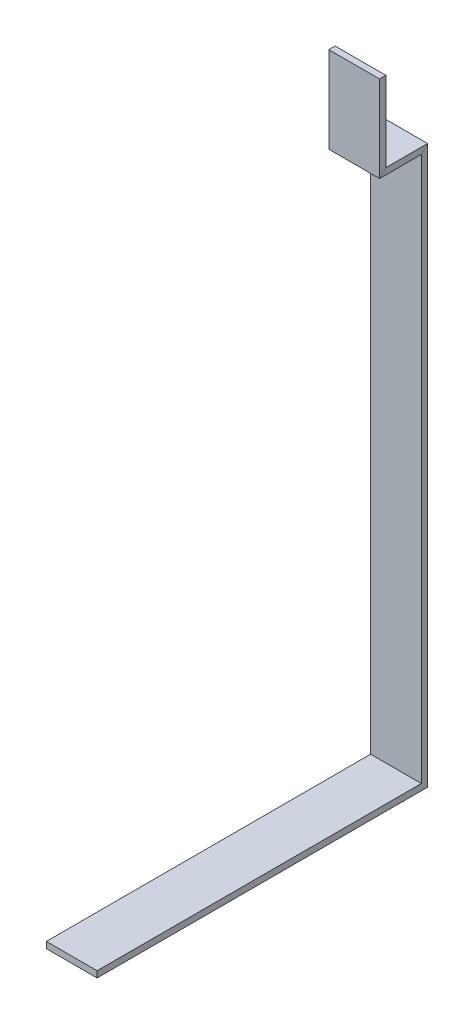
ISO-10303-21;
HEADER;
FILE_DESCRIPTION(('STEP AP214'),'2;1');
FILE_NAME('part.step','',(''),(''),'','','');
FILE_SCHEMA(('AUTOMOTIVE_DESIGN { 1 0 10303 214 1 1 1 1 }'));
ENDSEC;
DATA;
#1=APPLICATION_CONTEXT('core data for automotive mechanical design processes');
#2=APPLICATION_PROTOCOL_DEFINITION('international standard','automotive_design',2000,#1);
#3=PRODUCT_CONTEXT('',#1,'mechanical');
#4=PRODUCT('Part','Part','',(#3));
#5=PRODUCT_RELATED_PRODUCT_CATEGORY('part','',(#4));
#6=PRODUCT_DEFINITION_FORMATION('','',#4);
#7=PRODUCT_DEFINITION_CONTEXT('part definition',#1,'design');
#8=PRODUCT_DEFINITION('design','',#6,#7);
#9=PRODUCT_DEFINITION_SHAPE('','',#8);
#10=(LENGTH_UNIT() NAMED_UNIT(*) SI_UNIT(.MILLI.,.METRE.));
#11=(NAMED_UNIT(*) PLANE_ANGLE_UNIT() SI_UNIT($,.RADIAN.));
#12=(NAMED_UNIT(*) SI_UNIT($,.STERADIAN.) SOLID_ANGLE_UNIT());
#13=UNCERTAINTY_MEASURE_WITH_UNIT(LENGTH_MEASURE(1.E-05),#10,'distance_accuracy_value','');
#14=(GEOMETRIC_REPRESENTATION_CONTEXT(3) GLOBAL_UNCERTAINTY_ASSIGNED_CONTEXT((#13)) GLOBAL_UNIT_ASSIGNED_CONTEXT((#10,
#11,#12)) REPRESENTATION_CONTEXT('',''));
#15=CARTESIAN_POINT('',(0.,0.,0.));
#16=DIRECTION('',(0.,0.,1.));
#17=DIRECTION('',(1.,0.,0.));
#18=AXIS2_PLACEMENT_3D('',#15,#16,#17);
#19=CARTESIAN_POINT('',(25.4,3.155,330.7));
#20=DIRECTION('',(-1.,0.,0.));
#21=DIRECTION('',(0.,0.,1.));
#22=AXIS2_PLACEMENT_3D('',#19,#20,#21);
#23=PLANE('',#22);
#24=DIRECTION('',(0.,0.,-1.));
#25=VECTOR('',#24,1.);
#26=CARTESIAN_POINT('',(25.4,-3.155,330.7));
#27=LINE('',#26,#25);
#28=CARTESIAN_POINT('',(25.4,-3.155,330.7));
#29=VERTEX_POINT('',#28);
#30=CARTESIAN_POINT('',(25.4,-3.155,0.));
#31=VERTEX_POINT('',#30);
#32=EDGE_CURVE('E195',#29,#31,#27,.T.);
#33=ORIENTED_EDGE('',*,*,#32,.T.);
#34=DIRECTION('',(0.,1.,0.));
#35=VECTOR('',#34,1.);
#36=CARTESIAN_POINT('',(25.4,3.155,0.));
#37=LINE('',#36,#35);
#38=CARTESIAN_POINT('',(25.4,554.51,0.));
#39=VERTEX_POINT('',#38);
#40=EDGE_CURVE('E184',#31,#39,#37,.T.);
#41=ORIENTED_EDGE('',*,*,#40,.T.);
#42=DIRECTION('',(0.,-0.707106781186548,0.707106781186548));
#43=VECTOR('',#42,1.);
#44=CARTESIAN_POINT('',(25.4,547.9325,6.5775));
#45=LINE('',#44,#43);
#46=CARTESIAN_POINT('',(25.4,548.2,6.31));
#47=VERTEX_POINT('',#46);
#48=EDGE_CURVE('E141',#39,#47,#45,.T.);
#49=ORIENTED_EDGE('',*,*,#48,.T.);
#50=DIRECTION('',(0.,-1.,0.));
#51=VECTOR('',#50,1.);
#52=CARTESIAN_POINT('',(25.4,541.355,6.31));
#53=LINE('',#52,#51);
#54=CARTESIAN_POINT('',(25.4,3.155,6.31000000000004));
#55=VERTEX_POINT('',#54);
#56=EDGE_CURVE('E116',#47,#55,#53,.T.);
#57=ORIENTED_EDGE('',*,*,#56,.T.);
#58=DIRECTION('',(0.,0.,-1.));
#59=VECTOR('',#58,1.);
#60=CARTESIAN_POINT('',(25.4,3.155,330.7));
#61=LINE('',#60,#59);
#62=CARTESIAN_POINT('',(25.4,3.155,330.7));
#63=VERTEX_POINT('',#62);
#64=EDGE_CURVE('E11',#63,#55,#61,.T.);
#65=ORIENTED_EDGE('',*,*,#64,.F.);
#66=DIRECTION('',(0.,1.,0.));
#67=VECTOR('',#66,1.);
#68=CARTESIAN_POINT('',(25.4,3.155,330.7));
#69=LINE('',#68,#67);
#70=EDGE_CURVE('E185',#29,#63,#69,.T.);
#71=ORIENTED_EDGE('',*,*,#70,.F.);
#72=EDGE_LOOP('',(#33,#41,#49,#57,#65,#71));
#73=FACE_BOUND('',#72,.T.);
#74=ADVANCED_FACE('F35',(#73),#23,.F.);
#75=CARTESIAN_POINT('',(-25.4,3.155,330.7));
#76=DIRECTION('',(0.,-1.,0.));
#77=DIRECTION('',(0.,0.,-1.));
#78=AXIS2_PLACEMENT_3D('',#75,#76,#77);
#79=PLANE('',#78);
#80=ORIENTED_EDGE('',*,*,#64,.T.);
#81=DIRECTION('',(-1.,0.,0.));
#82=VECTOR('',#81,1.);
#83=CARTESIAN_POINT('',(-25.3999999999999,3.155,6.30999999999998));
#84=LINE('',#83,#82);
#85=CARTESIAN_POINT('',(-25.4,3.155,6.30999999999998));
#86=VERTEX_POINT('',#85);
#87=EDGE_CURVE('E51',#55,#86,#84,.T.);
#88=ORIENTED_EDGE('',*,*,#87,.T.);
#89=DIRECTION('',(0.,0.,-1.));
#90=VECTOR('',#89,1.);
#91=CARTESIAN_POINT('',(-25.4,3.155,330.7));
#92=LINE('',#91,#90);
#93=CARTESIAN_POINT('',(-25.4,3.155,330.7));
#94=VERTEX_POINT('',#93);
#95=EDGE_CURVE('E42',#94,#86,#92,.T.);
#96=ORIENTED_EDGE('',*,*,#95,.F.);
#97=DIRECTION('',(-1.,0.,0.));
#98=VECTOR('',#97,1.);
#99=CARTESIAN_POINT('',(-25.4,3.155,330.7));
#100=LINE('',#99,#98);
#101=EDGE_CURVE('E188',#63,#94,#100,.T.);
#102=ORIENTED_EDGE('',*,*,#101,.F.);
#103=EDGE_LOOP('',(#80,#88,#96,#102));
#104=FACE_BOUND('',#103,.T.);
#105=ADVANCED_FACE('F248',(#104),#79,.F.);
#106=CARTESIAN_POINT('',(-25.4,3.155,330.7));
#107=DIRECTION('',(1.,0.,0.));
#108=DIRECTION('',(0.,0.,-1.));
#109=AXIS2_PLACEMENT_3D('',#106,#107,#108);
#110=PLANE('',#109);
#111=ORIENTED_EDGE('',*,*,#95,.T.);
#112=DIRECTION('',(0.,-1.,0.));
#113=VECTOR('',#112,1.);
#114=CARTESIAN_POINT('',(-25.4,541.355,6.30999999999998));
#115=LINE('',#114,#113);
#116=CARTESIAN_POINT('',(-25.4,548.2,6.31));
#117=VERTEX_POINT('',#116);
#118=EDGE_CURVE('E108',#117,#86,#115,.T.);
#119=ORIENTED_EDGE('',*,*,#118,.F.);
#120=DIRECTION('',(0.,0.707106781186548,-0.707106781186548));
#121=VECTOR('',#120,1.);
#122=CARTESIAN_POINT('',(-25.4,544.7775,9.73249999999999));
#123=LINE('',#122,#121);
#124=CARTESIAN_POINT('',(-25.4,554.51,0.));
#125=VERTEX_POINT('',#124);
#126=EDGE_CURVE('E112',#117,#125,#123,.T.);
#127=ORIENTED_EDGE('',*,*,#126,.T.);
#128=DIRECTION('',(0.,-1.,0.));
#129=VECTOR('',#128,1.);
#130=CARTESIAN_POINT('',(-25.4,3.155,0.));
#131=LINE('',#130,#129);
#132=CARTESIAN_POINT('',(-25.4,-3.155,0.));
#133=VERTEX_POINT('',#132);
#134=EDGE_CURVE('E197',#125,#133,#131,.T.);
#135=ORIENTED_EDGE('',*,*,#134,.T.);
#136=DIRECTION('',(0.,0.,-1.));
#137=VECTOR('',#136,1.);
#138=CARTESIAN_POINT('',(-25.4,-3.155,330.7));
#139=LINE('',#138,#137);
#140=CARTESIAN_POINT('',(-25.4,-3.155,330.7));
#141=VERTEX_POINT('',#140);
#142=EDGE_CURVE('E202',#141,#133,#139,.T.);
#143=ORIENTED_EDGE('',*,*,#142,.F.);
#144=DIRECTION('',(0.,-1.,0.));
#145=VECTOR('',#144,1.);
#146=CARTESIAN_POINT('',(-25.4,3.155,330.7));
#147=LINE('',#146,#145);
#148=EDGE_CURVE('E191',#94,#141,#147,.T.);
#149=ORIENTED_EDGE('',*,*,#148,.F.);
#150=EDGE_LOOP('',(#111,#119,#127,#135,#143,#149));
#151=FACE_BOUND('',#150,.T.);
#152=ADVANCED_FACE('F110',(#151),#110,.F.);
#153=CARTESIAN_POINT('',(-25.4,-3.155,330.7));
#154=DIRECTION('',(0.,1.,0.));
#155=DIRECTION('',(0.,0.,1.));
#156=AXIS2_PLACEMENT_3D('',#153,#154,#155);
#157=PLANE('',#156);
#158=ORIENTED_EDGE('',*,*,#142,.T.);
#159=DIRECTION('',(1.,0.,0.));
#160=VECTOR('',#159,1.);
#161=CARTESIAN_POINT('',(-25.4,-3.155,0.));
#162=LINE('',#161,#160);
#163=EDGE_CURVE('E189',#133,#31,#162,.T.);
#164=ORIENTED_EDGE('',*,*,#163,.T.);
#165=ORIENTED_EDGE('',*,*,#32,.F.);
#166=DIRECTION('',(1.,0.,0.));
#167=VECTOR('',#166,1.);
#168=CARTESIAN_POINT('',(-25.4,-3.155,330.7));
#169=LINE('',#168,#167);
#170=EDGE_CURVE('E193',#141,#29,#169,.T.);
#171=ORIENTED_EDGE('',*,*,#170,.F.);
#172=EDGE_LOOP('',(#158,#164,#165,#171));
#173=FACE_BOUND('',#172,.T.);
#174=ADVANCED_FACE('F206',(#173),#157,.F.);
#175=CARTESIAN_POINT('',(0.,0.,330.7));
#176=DIRECTION('',(0.,0.,1.));
#177=DIRECTION('',(1.,0.,0.));
#178=AXIS2_PLACEMENT_3D('',#175,#176,#177);
#179=PLANE('',#178);
#180=ORIENTED_EDGE('',*,*,#70,.T.);
#181=ORIENTED_EDGE('',*,*,#101,.T.);
#182=ORIENTED_EDGE('',*,*,#148,.T.);
#183=ORIENTED_EDGE('',*,*,#170,.T.);
#184=EDGE_LOOP('',(#180,#181,#182,#183));
#185=FACE_BOUND('',#184,.T.);
#186=ADVANCED_FACE('F259',(#185),#179,.T.);
#187=CARTESIAN_POINT('',(0.,0.,0.));
#188=DIRECTION('',(0.,0.,1.));
#189=DIRECTION('',(1.,0.,0.));
#190=AXIS2_PLACEMENT_3D('',#187,#188,#189);
#191=PLANE('',#190);
#192=ORIENTED_EDGE('',*,*,#40,.F.);
#193=ORIENTED_EDGE('',*,*,#163,.F.);
#194=ORIENTED_EDGE('',*,*,#134,.F.);
#195=DIRECTION('',(1.,0.,0.));
#196=VECTOR('',#195,1.);
#197=CARTESIAN_POINT('',(-25.4,554.51,0.));
#198=LINE('',#197,#196);
#199=EDGE_CURVE('E127',#125,#39,#198,.T.);
#200=ORIENTED_EDGE('',*,*,#199,.T.);
#201=EDGE_LOOP('',(#192,#193,#194,#200));
#202=FACE_BOUND('',#201,.T.);
#203=ADVANCED_FACE('F212',(#202),#191,.F.);
#204=CARTESIAN_POINT('',(25.4,541.355,6.31));
#205=DIRECTION('',(0.,0.,1.));
#206=DIRECTION('',(1.,0.,0.));
#207=AXIS2_PLACEMENT_3D('',#204,#205,#206);
#208=PLANE('',#207);
#209=ORIENTED_EDGE('',*,*,#87,.F.);
#210=ORIENTED_EDGE('',*,*,#56,.F.);
#211=DIRECTION('',(-1.,0.,0.));
#212=VECTOR('',#211,1.);
#213=CARTESIAN_POINT('',(25.4,548.2,6.31));
#214=LINE('',#213,#212);
#215=EDGE_CURVE('E135',#47,#117,#214,.T.);
#216=ORIENTED_EDGE('',*,*,#215,.T.);
#217=ORIENTED_EDGE('',*,*,#118,.T.);
#218=EDGE_LOOP('',(#209,#210,#216,#217));
#219=FACE_BOUND('',#218,.T.);
#220=ADVANCED_FACE('F139',(#219),#208,.T.);
#221=CARTESIAN_POINT('',(0.,634.515,41.8100000000001));
#222=DIRECTION('',(0.,-1.,0.));
#223=DIRECTION('',(0.,0.,-1.));
#224=AXIS2_PLACEMENT_3D('',#221,#222,#223);
#225=PLANE('',#224);
#226=DIRECTION('',(0.,0.,-1.));
#227=VECTOR('',#226,1.);
#228=CARTESIAN_POINT('',(25.4,634.515,41.8100000000001));
#229=LINE('',#228,#227);
#230=CARTESIAN_POINT('',(25.4,634.515,48.1200000000001));
#231=VERTEX_POINT('',#230);
#232=CARTESIAN_POINT('',(25.4,634.515,41.8100000000001));
#233=VERTEX_POINT('',#232);
#234=EDGE_CURVE('E166',#231,#233,#229,.T.);
#235=ORIENTED_EDGE('',*,*,#234,.T.);
#236=DIRECTION('',(-1.,0.,0.));
#237=VECTOR('',#236,1.);
#238=CARTESIAN_POINT('',(-25.4,634.515,41.8100000000001));
#239=LINE('',#238,#237);
#240=CARTESIAN_POINT('',(-25.4,634.515,41.8100000000001));
#241=VERTEX_POINT('',#240);
#242=EDGE_CURVE('E164',#233,#241,#239,.T.);
#243=ORIENTED_EDGE('',*,*,#242,.T.);
#244=DIRECTION('',(0.,0.,1.));
#245=VECTOR('',#244,1.);
#246=CARTESIAN_POINT('',(-25.4,634.515,48.1200000000001));
#247=LINE('',#246,#245);
#248=CARTESIAN_POINT('',(-25.4,634.515,48.1200000000001));
#249=VERTEX_POINT('',#248);
#250=EDGE_CURVE('E170',#241,#249,#247,.T.);
#251=ORIENTED_EDGE('',*,*,#250,.T.);
#252=DIRECTION('',(1.,0.,0.));
#253=VECTOR('',#252,1.);
#254=CARTESIAN_POINT('',(25.4,634.515,48.1200000000001));
#255=LINE('',#254,#253);
#256=EDGE_CURVE('E168',#249,#231,#255,.T.);
#257=ORIENTED_EDGE('',*,*,#256,.T.);
#258=EDGE_LOOP('',(#235,#243,#251,#257));
#259=FACE_BOUND('',#258,.T.);
#260=ADVANCED_FACE('F232',(#259),#225,.F.);
#261=CARTESIAN_POINT('',(-25.4,547.7845,48.1200000000001));
#262=DIRECTION('',(-1.,0.,0.));
#263=DIRECTION('',(0.,0.,1.));
#264=AXIS2_PLACEMENT_3D('',#261,#262,#263);
#265=PLANE('',#264);
#266=DIRECTION('',(0.,0.707106781186548,-0.707106781186548));
#267=VECTOR('',#266,1.);
#268=CARTESIAN_POINT('',(-25.4,572.46775,23.8522500000001));
#269=LINE('',#268,#267);
#270=CARTESIAN_POINT('',(-25.4,548.2,48.12));
#271=VERTEX_POINT('',#270);
#272=CARTESIAN_POINT('',(-25.4,554.51,41.8100000000001));
#273=VERTEX_POINT('',#272);
#274=EDGE_CURVE('E156',#271,#273,#269,.T.);
#275=ORIENTED_EDGE('',*,*,#274,.F.);
#276=DIRECTION('',(0.,1.,0.));
#277=VECTOR('',#276,1.);
#278=CARTESIAN_POINT('',(-25.4,547.7845,48.1200000000001));
#279=LINE('',#278,#277);
#280=EDGE_CURVE('E178',#271,#249,#279,.T.);
#281=ORIENTED_EDGE('',*,*,#280,.T.);
#282=ORIENTED_EDGE('',*,*,#250,.F.);
#283=DIRECTION('',(0.,1.,0.));
#284=VECTOR('',#283,1.);
#285=CARTESIAN_POINT('',(-25.4,547.7845,41.8100000000001));
#286=LINE('',#285,#284);
#287=EDGE_CURVE('E160',#273,#241,#286,.T.);
#288=ORIENTED_EDGE('',*,*,#287,.F.);
#289=EDGE_LOOP('',(#275,#281,#282,#288));
#290=FACE_BOUND('',#289,.T.);
#291=ADVANCED_FACE('F228',(#290),#265,.T.);
#292=CARTESIAN_POINT('',(25.4,547.7845,48.1200000000001));
#293=DIRECTION('',(0.,0.,1.));
#294=DIRECTION('',(1.,0.,0.));
#295=AXIS2_PLACEMENT_3D('',#292,#293,#294);
#296=PLANE('',#295);
#297=DIRECTION('',(-1.,0.,0.));
#298=VECTOR('',#297,1.);
#299=CARTESIAN_POINT('',(25.4,548.2,48.12));
#300=LINE('',#299,#298);
#301=CARTESIAN_POINT('',(25.4,548.2,48.1200000000001));
#302=VERTEX_POINT('',#301);
#303=EDGE_CURVE('E128',#302,#271,#300,.T.);
#304=ORIENTED_EDGE('',*,*,#303,.F.);
#305=DIRECTION('',(0.,1.,0.));
#306=VECTOR('',#305,1.);
#307=CARTESIAN_POINT('',(25.4,547.7845,48.1200000000001));
#308=LINE('',#307,#306);
#309=EDGE_CURVE('E175',#302,#231,#308,.T.);
#310=ORIENTED_EDGE('',*,*,#309,.T.);
#311=ORIENTED_EDGE('',*,*,#256,.F.);
#312=ORIENTED_EDGE('',*,*,#280,.F.);
#313=EDGE_LOOP('',(#304,#310,#311,#312));
#314=FACE_BOUND('',#313,.T.);
#315=ADVANCED_FACE('F235',(#314),#296,.T.);
#316=CARTESIAN_POINT('',(25.4,547.7845,41.8100000000001));
#317=DIRECTION('',(1.,0.,0.));
#318=DIRECTION('',(0.,0.,-1.));
#319=AXIS2_PLACEMENT_3D('',#316,#317,#318);
#320=PLANE('',#319);
#321=DIRECTION('',(0.,-0.707106781186548,0.707106781186548));
#322=VECTOR('',#321,1.);
#323=CARTESIAN_POINT('',(25.4,575.62275,20.6972500000001));
#324=LINE('',#323,#322);
#325=CARTESIAN_POINT('',(25.4,554.51,41.8100000000001));
#326=VERTEX_POINT('',#325);
#327=EDGE_CURVE('E150',#326,#302,#324,.T.);
#328=ORIENTED_EDGE('',*,*,#327,.F.);
#329=DIRECTION('',(0.,1.,0.));
#330=VECTOR('',#329,1.);
#331=CARTESIAN_POINT('',(25.4,547.7845,41.8100000000001));
#332=LINE('',#331,#330);
#333=EDGE_CURVE('E172',#326,#233,#332,.T.);
#334=ORIENTED_EDGE('',*,*,#333,.T.);
#335=ORIENTED_EDGE('',*,*,#234,.F.);
#336=ORIENTED_EDGE('',*,*,#309,.F.);
#337=EDGE_LOOP('',(#328,#334,#335,#336));
#338=FACE_BOUND('',#337,.T.);
#339=ADVANCED_FACE('F238',(#338),#320,.T.);
#340=CARTESIAN_POINT('',(-25.4,547.7845,41.8100000000001));
#341=DIRECTION('',(0.,0.,-1.));
#342=DIRECTION('',(-1.,0.,0.));
#343=AXIS2_PLACEMENT_3D('',#340,#341,#342);
#344=PLANE('',#343);
#345=DIRECTION('',(1.,0.,0.));
#346=VECTOR('',#345,1.);
#347=CARTESIAN_POINT('',(-25.4,554.51,41.8100000000001));
#348=LINE('',#347,#346);
#349=EDGE_CURVE('E153',#273,#326,#348,.T.);
#350=ORIENTED_EDGE('',*,*,#349,.F.);
#351=ORIENTED_EDGE('',*,*,#287,.T.);
#352=ORIENTED_EDGE('',*,*,#242,.F.);
#353=ORIENTED_EDGE('',*,*,#333,.F.);
#354=EDGE_LOOP('',(#350,#351,#352,#353));
#355=FACE_BOUND('',#354,.T.);
#356=ADVANCED_FACE('F224',(#355),#344,.T.);
#357=CARTESIAN_POINT('',(-25.4,554.51,-0.415499999999902));
#358=DIRECTION('',(0.,1.,0.));
#359=DIRECTION('',(-1.,0.,0.));
#360=AXIS2_PLACEMENT_3D('',#357,#358,#359);
#361=PLANE('',#360);
#362=DIRECTION('',(0.,0.,1.));
#363=VECTOR('',#362,1.);
#364=CARTESIAN_POINT('',(-25.4,554.51,-0.415499999999902));
#365=LINE('',#364,#363);
#366=EDGE_CURVE('E126',#125,#273,#365,.T.);
#367=ORIENTED_EDGE('',*,*,#366,.T.);
#368=ORIENTED_EDGE('',*,*,#349,.T.);
#369=DIRECTION('',(0.,0.,1.));
#370=VECTOR('',#369,1.);
#371=CARTESIAN_POINT('',(25.4,554.51,-0.415499999999902));
#372=LINE('',#371,#370);
#373=EDGE_CURVE('E157',#39,#326,#372,.T.);
#374=ORIENTED_EDGE('',*,*,#373,.F.);
#375=ORIENTED_EDGE('',*,*,#199,.F.);
#376=EDGE_LOOP('',(#367,#368,#374,#375));
#377=FACE_BOUND('',#376,.T.);
#378=ADVANCED_FACE('F220',(#377),#361,.T.);
#379=CARTESIAN_POINT('',(25.4,554.51,-0.415499999999902));
#380=DIRECTION('',(1.,0.,0.));
#381=DIRECTION('',(0.,0.,-1.));
#382=AXIS2_PLACEMENT_3D('',#379,#380,#381);
#383=PLANE('',#382);
#384=ORIENTED_EDGE('',*,*,#373,.T.);
#385=ORIENTED_EDGE('',*,*,#327,.T.);
#386=DIRECTION('',(0.,0.,1.));
#387=VECTOR('',#386,1.);
#388=CARTESIAN_POINT('',(25.4,548.2,-0.415499999999902));
#389=LINE('',#388,#387);
#390=EDGE_CURVE('E137',#47,#302,#389,.T.);
#391=ORIENTED_EDGE('',*,*,#390,.F.);
#392=ORIENTED_EDGE('',*,*,#48,.F.);
#393=EDGE_LOOP('',(#384,#385,#391,#392));
#394=FACE_BOUND('',#393,.T.);
#395=ADVANCED_FACE('F218',(#394),#383,.T.);
#396=CARTESIAN_POINT('',(25.4,548.2,-0.415499999999902));
#397=DIRECTION('',(0.,-1.,0.));
#398=DIRECTION('',(1.,0.,0.));
#399=AXIS2_PLACEMENT_3D('',#396,#397,#398);
#400=PLANE('',#399);
#401=ORIENTED_EDGE('',*,*,#390,.T.);
#402=ORIENTED_EDGE('',*,*,#303,.T.);
#403=DIRECTION('',(0.,0.,1.));
#404=VECTOR('',#403,1.);
#405=CARTESIAN_POINT('',(-25.4,548.2,-0.415499999999902));
#406=LINE('',#405,#404);
#407=EDGE_CURVE('E124',#117,#271,#406,.T.);
#408=ORIENTED_EDGE('',*,*,#407,.F.);
#409=ORIENTED_EDGE('',*,*,#215,.F.);
#410=EDGE_LOOP('',(#401,#402,#408,#409));
#411=FACE_BOUND('',#410,.T.);
#412=ADVANCED_FACE('F134',(#411),#400,.T.);
#413=CARTESIAN_POINT('',(-25.4,548.2,-0.415499999999902));
#414=DIRECTION('',(-1.,0.,0.));
#415=DIRECTION('',(0.,0.,1.));
#416=AXIS2_PLACEMENT_3D('',#413,#414,#415);
#417=PLANE('',#416);
#418=ORIENTED_EDGE('',*,*,#407,.T.);
#419=ORIENTED_EDGE('',*,*,#274,.T.);
#420=ORIENTED_EDGE('',*,*,#366,.F.);
#421=ORIENTED_EDGE('',*,*,#126,.F.);
#422=EDGE_LOOP('',(#418,#419,#420,#421));
#423=FACE_BOUND('',#422,.T.);
#424=ADVANCED_FACE('F122',(#423),#417,.T.);
#425=CLOSED_SHELL('',(#74,#105,#152,#174,#186,#203,#220,#260,#291,#315,#339,#356,#378,#395,#412,#424));
#426=MANIFOLD_SOLID_BREP('B2',#425);
#427=ADVANCED_BREP_SHAPE_REPRESENTATION('',(#18,#426),#14);
#428=SHAPE_DEFINITION_REPRESENTATION(#9,#427);
ENDSEC;
END-ISO-10303-21;
